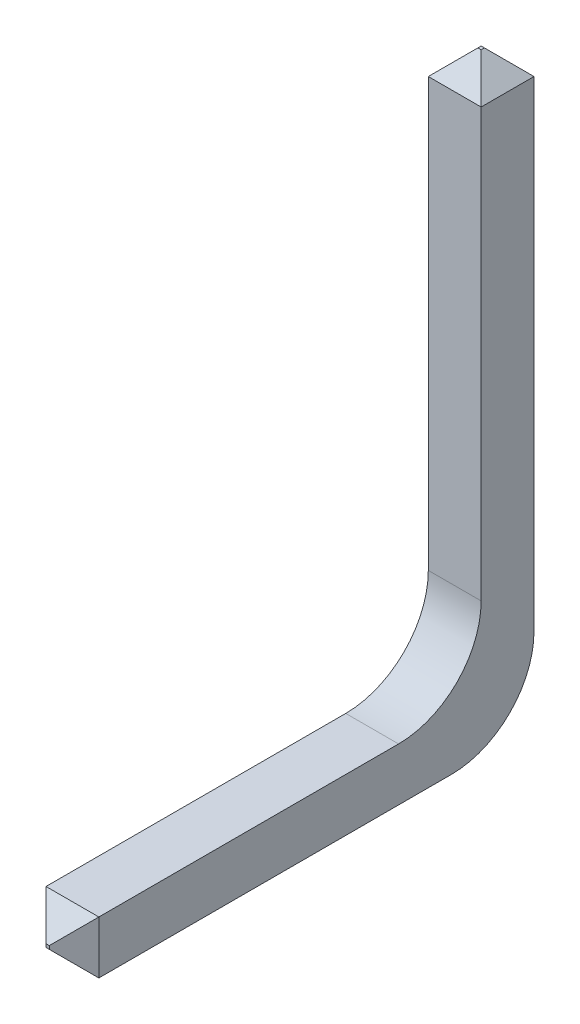
ISO-10303-21;
HEADER;
FILE_DESCRIPTION(('STEP AP214'),'2;1');
FILE_NAME('part.step','',(''),(''),'','','');
FILE_SCHEMA(('AUTOMOTIVE_DESIGN { 1 0 10303 214 1 1 1 1 }'));
ENDSEC;
DATA;
#1=APPLICATION_CONTEXT('core data for automotive mechanical design processes');
#2=APPLICATION_PROTOCOL_DEFINITION('international standard','automotive_design',2000,#1);
#3=PRODUCT_CONTEXT('',#1,'mechanical');
#4=PRODUCT('Part','Part','',(#3));
#5=PRODUCT_RELATED_PRODUCT_CATEGORY('part','',(#4));
#6=PRODUCT_DEFINITION_FORMATION('','',#4);
#7=PRODUCT_DEFINITION_CONTEXT('part definition',#1,'design');
#8=PRODUCT_DEFINITION('design','',#6,#7);
#9=PRODUCT_DEFINITION_SHAPE('','',#8);
#10=(LENGTH_UNIT() NAMED_UNIT(*) SI_UNIT(.MILLI.,.METRE.));
#11=(NAMED_UNIT(*) PLANE_ANGLE_UNIT() SI_UNIT($,.RADIAN.));
#12=(NAMED_UNIT(*) SI_UNIT($,.STERADIAN.) SOLID_ANGLE_UNIT());
#13=UNCERTAINTY_MEASURE_WITH_UNIT(LENGTH_MEASURE(1.E-05),#10,'distance_accuracy_value','');
#14=(GEOMETRIC_REPRESENTATION_CONTEXT(3) GLOBAL_UNCERTAINTY_ASSIGNED_CONTEXT((#13)) GLOBAL_UNIT_ASSIGNED_CONTEXT((#10,
#11,#12)) REPRESENTATION_CONTEXT('',''));
#15=CARTESIAN_POINT('',(0.,0.,0.));
#16=DIRECTION('',(0.,0.,1.));
#17=DIRECTION('',(1.,0.,0.));
#18=AXIS2_PLACEMENT_3D('',#15,#16,#17);
#19=CARTESIAN_POINT('',(39.447289,52.03,2.));
#20=DIRECTION('',(0.,-1.,0.));
#21=DIRECTION('',(0.,0.,-1.));
#22=AXIS2_PLACEMENT_3D('',#19,#20,#21);
#23=PLANE('',#22);
#24=DIRECTION('',(1.,0.,0.));
#25=VECTOR('',#24,1.);
#26=CARTESIAN_POINT('',(38.807289,52.03,1.43));
#27=LINE('',#26,#25);
#28=CARTESIAN_POINT('',(38.807289,52.03,1.43));
#29=VERTEX_POINT('',#28);
#30=CARTESIAN_POINT('',(39.447289,52.03,1.43));
#31=VERTEX_POINT('',#30);
#32=EDGE_CURVE('E149',#29,#31,#27,.T.);
#33=ORIENTED_EDGE('',*,*,#32,.T.);
#34=DIRECTION('',(0.,0.,1.));
#35=VECTOR('',#34,1.);
#36=CARTESIAN_POINT('',(39.447289,52.03,1.43));
#37=LINE('',#36,#35);
#38=CARTESIAN_POINT('',(39.447289,52.03,5.7));
#39=VERTEX_POINT('',#38);
#40=EDGE_CURVE('E143',#31,#39,#37,.T.);
#41=ORIENTED_EDGE('',*,*,#40,.T.);
#42=DIRECTION('',(-1.,0.,0.));
#43=VECTOR('',#42,1.);
#44=CARTESIAN_POINT('',(39.447289,52.03,5.7));
#45=LINE('',#44,#43);
#46=CARTESIAN_POINT('',(38.807289,52.03,5.7));
#47=VERTEX_POINT('',#46);
#48=EDGE_CURVE('E268',#39,#47,#45,.T.);
#49=ORIENTED_EDGE('',*,*,#48,.T.);
#50=DIRECTION('',(0.,0.,-1.));
#51=VECTOR('',#50,1.);
#52=CARTESIAN_POINT('',(38.807289,52.03,5.7));
#53=LINE('',#52,#51);
#54=EDGE_CURVE('E184',#47,#29,#53,.T.);
#55=ORIENTED_EDGE('',*,*,#54,.T.);
#56=EDGE_LOOP('',(#33,#41,#49,#55));
#57=FACE_BOUND('',#56,.T.);
#58=ADVANCED_FACE('F17',(#57),#23,.T.);
#59=CARTESIAN_POINT('',(39.127289,59.,0.92));
#60=DIRECTION('',(0.,-0.707106781186548,-0.707106781186548));
#61=DIRECTION('',(0.,-0.707106781186548,0.707106781186548));
#62=AXIS2_PLACEMENT_3D('',#59,#60,#61);
#63=PLANE('',#62);
#64=DIRECTION('',(-1.,0.,0.));
#65=VECTOR('',#64,1.);
#66=CARTESIAN_POINT('',(39.147289,59.15,0.77));
#67=LINE('',#66,#65);
#68=CARTESIAN_POINT('',(39.147289,59.15,0.77));
#69=VERTEX_POINT('',#68);
#70=CARTESIAN_POINT('',(39.107289,59.15,0.77));
#71=VERTEX_POINT('',#70);
#72=EDGE_CURVE('E221',#69,#71,#67,.T.);
#73=ORIENTED_EDGE('',*,*,#72,.T.);
#74=DIRECTION('',(0.577350269189625,0.577350269189625,-0.577350269189628));
#75=VECTOR('',#74,1.);
#76=CARTESIAN_POINT('',(38.807289,58.85,1.07));
#77=LINE('',#76,#75);
#78=CARTESIAN_POINT('',(38.807289,58.85,1.07));
#79=VERTEX_POINT('',#78);
#80=EDGE_CURVE('E199',#79,#71,#77,.T.);
#81=ORIENTED_EDGE('',*,*,#80,.F.);
#82=DIRECTION('',(1.,0.,0.));
#83=VECTOR('',#82,1.);
#84=CARTESIAN_POINT('',(38.807289,58.85,1.07));
#85=LINE('',#84,#83);
#86=CARTESIAN_POINT('',(39.447289,58.85,1.07));
#87=VERTEX_POINT('',#86);
#88=EDGE_CURVE('E11',#79,#87,#85,.T.);
#89=ORIENTED_EDGE('',*,*,#88,.T.);
#90=DIRECTION('',(0.577350269189625,-0.577350269189625,0.577350269189628));
#91=VECTOR('',#90,1.);
#92=CARTESIAN_POINT('',(39.147289,59.15,0.77));
#93=LINE('',#92,#91);
#94=EDGE_CURVE('E232',#69,#87,#93,.T.);
#95=ORIENTED_EDGE('',*,*,#94,.F.);
#96=EDGE_LOOP('',(#73,#81,#89,#95));
#97=FACE_BOUND('',#96,.T.);
#98=ADVANCED_FACE('F309',(#97),#63,.F.);
#99=CARTESIAN_POINT('',(39.447289,52.67,1.07));
#100=DIRECTION('',(0.,0.,1.));
#101=DIRECTION('',(1.,0.,0.));
#102=AXIS2_PLACEMENT_3D('',#99,#100,#101);
#103=PLANE('',#102);
#104=DIRECTION('',(1.,0.,0.));
#105=VECTOR('',#104,1.);
#106=CARTESIAN_POINT('',(38.807289,53.67,1.07));
#107=LINE('',#106,#105);
#108=CARTESIAN_POINT('',(38.807289,53.67,1.07));
#109=VERTEX_POINT('',#108);
#110=CARTESIAN_POINT('',(39.447289,53.67,1.07));
#111=VERTEX_POINT('',#110);
#112=EDGE_CURVE('E25',#109,#111,#107,.T.);
#113=ORIENTED_EDGE('',*,*,#112,.T.);
#114=DIRECTION('',(0.,1.,0.));
#115=VECTOR('',#114,1.);
#116=CARTESIAN_POINT('',(39.447289,53.67,1.07));
#117=LINE('',#116,#115);
#118=EDGE_CURVE('E243',#111,#87,#117,.T.);
#119=ORIENTED_EDGE('',*,*,#118,.T.);
#120=ORIENTED_EDGE('',*,*,#88,.F.);
#121=DIRECTION('',(0.,-1.,0.));
#122=VECTOR('',#121,1.);
#123=CARTESIAN_POINT('',(38.807289,58.85,1.07));
#124=LINE('',#123,#122);
#125=EDGE_CURVE('E194',#79,#109,#124,.T.);
#126=ORIENTED_EDGE('',*,*,#125,.T.);
#127=EDGE_LOOP('',(#113,#119,#120,#126));
#128=FACE_BOUND('',#127,.T.);
#129=ADVANCED_FACE('F287',(#128),#103,.T.);
#130=CARTESIAN_POINT('',(39.53728678713,53.67,2.07));
#131=DIRECTION('',(1.,0.,0.));
#132=DIRECTION('',(0.,-1.,0.));
#133=AXIS2_PLACEMENT_3D('',#130,#131,#132);
#134=CYLINDRICAL_SURFACE('',#133,1.);
#135=DIRECTION('',(-1.,0.,0.));
#136=VECTOR('',#135,1.);
#137=CARTESIAN_POINT('',(39.447289,52.67,2.07));
#138=LINE('',#137,#136);
#139=CARTESIAN_POINT('',(39.447289,52.67,2.07));
#140=VERTEX_POINT('',#139);
#141=CARTESIAN_POINT('',(38.807289,52.67,2.07));
#142=VERTEX_POINT('',#141);
#143=EDGE_CURVE('E281',#140,#142,#138,.T.);
#144=ORIENTED_EDGE('',*,*,#143,.F.);
#145=CARTESIAN_POINT('',(39.447289,53.67,2.07));
#146=DIRECTION('',(1.,0.,0.));
#147=DIRECTION('',(0.,-1.,0.));
#148=AXIS2_PLACEMENT_3D('',#145,#146,#147);
#149=CIRCLE('',#148,1.);
#150=EDGE_CURVE('E215',#140,#111,#149,.T.);
#151=ORIENTED_EDGE('',*,*,#150,.T.);
#152=ORIENTED_EDGE('',*,*,#112,.F.);
#153=CARTESIAN_POINT('',(38.807289,53.67,2.07));
#154=DIRECTION('',(-1.,0.,0.));
#155=DIRECTION('',(0.,0.,-1.));
#156=AXIS2_PLACEMENT_3D('',#153,#154,#155);
#157=CIRCLE('',#156,1.);
#158=EDGE_CURVE('E181',#109,#142,#157,.T.);
#159=ORIENTED_EDGE('',*,*,#158,.T.);
#160=EDGE_LOOP('',(#144,#151,#152,#159));
#161=FACE_BOUND('',#160,.T.);
#162=ADVANCED_FACE('F293',(#161),#134,.F.);
#163=CARTESIAN_POINT('',(38.807289,52.67,2.));
#164=DIRECTION('',(0.,1.,0.));
#165=DIRECTION('',(1.,0.,0.));
#166=AXIS2_PLACEMENT_3D('',#163,#164,#165);
#167=PLANE('',#166);
#168=DIRECTION('',(-1.,0.,0.));
#169=VECTOR('',#168,1.);
#170=CARTESIAN_POINT('',(39.447289,52.67,5.7));
#171=LINE('',#170,#169);
#172=CARTESIAN_POINT('',(39.447289,52.67,5.7));
#173=VERTEX_POINT('',#172);
#174=CARTESIAN_POINT('',(38.807289,52.67,5.7));
#175=VERTEX_POINT('',#174);
#176=EDGE_CURVE('E278',#173,#175,#171,.T.);
#177=ORIENTED_EDGE('',*,*,#176,.F.);
#178=DIRECTION('',(0.,0.,-1.));
#179=VECTOR('',#178,1.);
#180=CARTESIAN_POINT('',(39.447289,52.67,5.7));
#181=LINE('',#180,#179);
#182=EDGE_CURVE('E210',#173,#140,#181,.T.);
#183=ORIENTED_EDGE('',*,*,#182,.T.);
#184=ORIENTED_EDGE('',*,*,#143,.T.);
#185=DIRECTION('',(0.,0.,1.));
#186=VECTOR('',#185,1.);
#187=CARTESIAN_POINT('',(38.807289,52.67,2.07));
#188=LINE('',#187,#186);
#189=EDGE_CURVE('E177',#142,#175,#188,.T.);
#190=ORIENTED_EDGE('',*,*,#189,.T.);
#191=EDGE_LOOP('',(#177,#183,#184,#190));
#192=FACE_BOUND('',#191,.T.);
#193=ADVANCED_FACE('F319',(#192),#167,.T.);
#194=CARTESIAN_POINT('',(39.127289,52.52,5.85));
#195=DIRECTION('',(0.,-0.707106781186548,-0.707106781186548));
#196=DIRECTION('',(0.,-0.707106781186548,0.707106781186548));
#197=AXIS2_PLACEMENT_3D('',#194,#195,#196);
#198=PLANE('',#197);
#199=ORIENTED_EDGE('',*,*,#176,.T.);
#200=DIRECTION('',(0.577350269189631,-0.577350269189617,0.577350269189629));
#201=VECTOR('',#200,1.);
#202=CARTESIAN_POINT('',(38.807289,52.67,5.7));
#203=LINE('',#202,#201);
#204=CARTESIAN_POINT('',(39.107289,52.37,6.));
#205=VERTEX_POINT('',#204);
#206=EDGE_CURVE('E37',#175,#205,#203,.T.);
#207=ORIENTED_EDGE('',*,*,#206,.T.);
#208=DIRECTION('',(1.,0.,0.));
#209=VECTOR('',#208,1.);
#210=CARTESIAN_POINT('',(39.107289,52.37,6.));
#211=LINE('',#210,#209);
#212=CARTESIAN_POINT('',(39.147289,52.37,6.));
#213=VERTEX_POINT('',#212);
#214=EDGE_CURVE('E271',#205,#213,#211,.T.);
#215=ORIENTED_EDGE('',*,*,#214,.T.);
#216=DIRECTION('',(-0.577350269189625,-0.577350269189625,0.577350269189627));
#217=VECTOR('',#216,1.);
#218=CARTESIAN_POINT('',(39.447289,52.67,5.7));
#219=LINE('',#218,#217);
#220=EDGE_CURVE('E214',#173,#213,#219,.T.);
#221=ORIENTED_EDGE('',*,*,#220,.F.);
#222=EDGE_LOOP('',(#199,#207,#215,#221));
#223=FACE_BOUND('',#222,.T.);
#224=ADVANCED_FACE('F333',(#223),#198,.F.);
#225=CARTESIAN_POINT('',(38.957289,52.35,5.85));
#226=DIRECTION('',(0.707106781186548,0.,-0.707106781186548));
#227=DIRECTION('',(0.,-1.,0.));
#228=AXIS2_PLACEMENT_3D('',#225,#226,#227);
#229=PLANE('',#228);
#230=DIRECTION('',(0.,1.,0.));
#231=VECTOR('',#230,1.);
#232=CARTESIAN_POINT('',(39.107289,52.33,6.));
#233=LINE('',#232,#231);
#234=CARTESIAN_POINT('',(39.107289,52.33,6.));
#235=VERTEX_POINT('',#234);
#236=EDGE_CURVE('E46',#235,#205,#233,.T.);
#237=ORIENTED_EDGE('',*,*,#236,.T.);
#238=ORIENTED_EDGE('',*,*,#206,.F.);
#239=DIRECTION('',(0.,-1.,0.));
#240=VECTOR('',#239,1.);
#241=CARTESIAN_POINT('',(38.807289,52.67,5.7));
#242=LINE('',#241,#240);
#243=EDGE_CURVE('E182',#175,#47,#242,.T.);
#244=ORIENTED_EDGE('',*,*,#243,.T.);
#245=DIRECTION('',(-0.577350269189626,-0.577350269189626,-0.577350269189625));
#246=VECTOR('',#245,1.);
#247=CARTESIAN_POINT('',(39.107289,52.33,6.));
#248=LINE('',#247,#246);
#249=EDGE_CURVE('E264',#235,#47,#248,.T.);
#250=ORIENTED_EDGE('',*,*,#249,.F.);
#251=EDGE_LOOP('',(#237,#238,#244,#250));
#252=FACE_BOUND('',#251,.T.);
#253=ADVANCED_FACE('F331',(#252),#229,.F.);
#254=CARTESIAN_POINT('',(39.53728678713,53.94319870042,6.));
#255=DIRECTION('',(0.,0.,1.));
#256=DIRECTION('',(1.,0.,0.));
#257=AXIS2_PLACEMENT_3D('',#254,#255,#256);
#258=PLANE('',#257);
#259=DIRECTION('',(1.,0.,0.));
#260=VECTOR('',#259,1.);
#261=CARTESIAN_POINT('',(39.107289,52.33,6.));
#262=LINE('',#261,#260);
#263=CARTESIAN_POINT('',(39.147289,52.33,6.));
#264=VERTEX_POINT('',#263);
#265=EDGE_CURVE('E261',#235,#264,#262,.T.);
#266=ORIENTED_EDGE('',*,*,#265,.T.);
#267=DIRECTION('',(0.,1.,0.));
#268=VECTOR('',#267,1.);
#269=CARTESIAN_POINT('',(39.147289,52.33,6.));
#270=LINE('',#269,#268);
#271=EDGE_CURVE('E253',#264,#213,#270,.T.);
#272=ORIENTED_EDGE('',*,*,#271,.T.);
#273=ORIENTED_EDGE('',*,*,#214,.F.);
#274=ORIENTED_EDGE('',*,*,#236,.F.);
#275=EDGE_LOOP('',(#266,#272,#273,#274));
#276=FACE_BOUND('',#275,.T.);
#277=ADVANCED_FACE('F332',(#276),#258,.T.);
#278=CARTESIAN_POINT('',(39.127289,52.18,5.85));
#279=DIRECTION('',(0.,-0.707106781186548,0.707106781186548));
#280=DIRECTION('',(-1.,0.,0.));
#281=AXIS2_PLACEMENT_3D('',#278,#279,#280);
#282=PLANE('',#281);
#283=ORIENTED_EDGE('',*,*,#265,.F.);
#284=ORIENTED_EDGE('',*,*,#249,.T.);
#285=ORIENTED_EDGE('',*,*,#48,.F.);
#286=DIRECTION('',(-0.577350269189625,0.577350269189625,0.577350269189627));
#287=VECTOR('',#286,1.);
#288=CARTESIAN_POINT('',(39.447289,52.03,5.7));
#289=LINE('',#288,#287);
#290=EDGE_CURVE('E257',#39,#264,#289,.T.);
#291=ORIENTED_EDGE('',*,*,#290,.T.);
#292=EDGE_LOOP('',(#283,#284,#285,#291));
#293=FACE_BOUND('',#292,.T.);
#294=ADVANCED_FACE('F329',(#293),#282,.T.);
#295=CARTESIAN_POINT('',(39.297289,52.35,5.85));
#296=DIRECTION('',(0.707106781186548,0.,0.707106781186548));
#297=DIRECTION('',(0.,-1.,0.));
#298=AXIS2_PLACEMENT_3D('',#295,#296,#297);
#299=PLANE('',#298);
#300=DIRECTION('',(0.,-1.,0.));
#301=VECTOR('',#300,1.);
#302=CARTESIAN_POINT('',(39.447289,52.67,5.7));
#303=LINE('',#302,#301);
#304=EDGE_CURVE('E229',#173,#39,#303,.T.);
#305=ORIENTED_EDGE('',*,*,#304,.F.);
#306=ORIENTED_EDGE('',*,*,#220,.T.);
#307=ORIENTED_EDGE('',*,*,#271,.F.);
#308=ORIENTED_EDGE('',*,*,#290,.F.);
#309=EDGE_LOOP('',(#305,#306,#307,#308));
#310=FACE_BOUND('',#309,.T.);
#311=ADVANCED_FACE('F324',(#310),#299,.T.);
#312=CARTESIAN_POINT('',(39.447289,52.67,-3.2));
#313=DIRECTION('',(1.,0.,0.));
#314=DIRECTION('',(0.,1.,0.));
#315=AXIS2_PLACEMENT_3D('',#312,#313,#314);
#316=PLANE('',#315);
#317=ORIENTED_EDGE('',*,*,#304,.T.);
#318=ORIENTED_EDGE('',*,*,#40,.F.);
#319=CARTESIAN_POINT('',(39.447289,53.03,1.43));
#320=DIRECTION('',(-1.,0.,0.));
#321=DIRECTION('',(0.,0.,-1.));
#322=AXIS2_PLACEMENT_3D('',#319,#320,#321);
#323=CIRCLE('',#322,1.);
#324=CARTESIAN_POINT('',(39.447289,53.03,0.43));
#325=VERTEX_POINT('',#324);
#326=EDGE_CURVE('E135',#325,#31,#323,.T.);
#327=ORIENTED_EDGE('',*,*,#326,.F.);
#328=DIRECTION('',(0.,1.,0.));
#329=VECTOR('',#328,1.);
#330=CARTESIAN_POINT('',(39.447289,53.03,0.43));
#331=LINE('',#330,#329);
#332=CARTESIAN_POINT('',(39.447289,58.85,0.43));
#333=VERTEX_POINT('',#332);
#334=EDGE_CURVE('E140',#325,#333,#331,.T.);
#335=ORIENTED_EDGE('',*,*,#334,.T.);
#336=DIRECTION('',(0.,0.,1.));
#337=VECTOR('',#336,1.);
#338=CARTESIAN_POINT('',(39.447289,58.85,0.43000000000003));
#339=LINE('',#338,#337);
#340=EDGE_CURVE('E235',#333,#87,#339,.T.);
#341=ORIENTED_EDGE('',*,*,#340,.T.);
#342=ORIENTED_EDGE('',*,*,#118,.F.);
#343=ORIENTED_EDGE('',*,*,#150,.F.);
#344=ORIENTED_EDGE('',*,*,#182,.F.);
#345=EDGE_LOOP('',(#317,#318,#327,#335,#341,#342,#343,#344));
#346=FACE_BOUND('',#345,.T.);
#347=ADVANCED_FACE('F138',(#346),#316,.T.);
#348=CARTESIAN_POINT('',(39.297289,59.,0.75));
#349=DIRECTION('',(0.707106781186548,0.707106781186548,0.));
#350=DIRECTION('',(0.,0.,-1.));
#351=AXIS2_PLACEMENT_3D('',#348,#349,#350);
#352=PLANE('',#351);
#353=ORIENTED_EDGE('',*,*,#340,.F.);
#354=DIRECTION('',(-0.57735026918969,0.577350269189595,0.577350269189593));
#355=VECTOR('',#354,1.);
#356=CARTESIAN_POINT('',(39.447289,58.85,0.43));
#357=LINE('',#356,#355);
#358=CARTESIAN_POINT('',(39.147289,59.15,0.73));
#359=VERTEX_POINT('',#358);
#360=EDGE_CURVE('E226',#333,#359,#357,.T.);
#361=ORIENTED_EDGE('',*,*,#360,.T.);
#362=DIRECTION('',(0.,0.,-1.));
#363=VECTOR('',#362,1.);
#364=CARTESIAN_POINT('',(39.147289,59.15,0.77));
#365=LINE('',#364,#363);
#366=EDGE_CURVE('E222',#69,#359,#365,.T.);
#367=ORIENTED_EDGE('',*,*,#366,.F.);
#368=ORIENTED_EDGE('',*,*,#94,.T.);
#369=EDGE_LOOP('',(#353,#361,#367,#368));
#370=FACE_BOUND('',#369,.T.);
#371=ADVANCED_FACE('F297',(#370),#352,.T.);
#372=CARTESIAN_POINT('',(39.127289,59.,0.58));
#373=DIRECTION('',(0.,0.707106781186548,-0.707106781186548));
#374=DIRECTION('',(-1.,0.,0.));
#375=AXIS2_PLACEMENT_3D('',#372,#373,#374);
#376=PLANE('',#375);
#377=DIRECTION('',(-1.,0.,0.));
#378=VECTOR('',#377,1.);
#379=CARTESIAN_POINT('',(39.147289,59.15,0.73));
#380=LINE('',#379,#378);
#381=CARTESIAN_POINT('',(39.107289,59.15,0.73));
#382=VERTEX_POINT('',#381);
#383=EDGE_CURVE('E203',#359,#382,#380,.T.);
#384=ORIENTED_EDGE('',*,*,#383,.F.);
#385=ORIENTED_EDGE('',*,*,#360,.F.);
#386=DIRECTION('',(-1.,0.,0.));
#387=VECTOR('',#386,1.);
#388=CARTESIAN_POINT('',(39.447289,58.85,0.43));
#389=LINE('',#388,#387);
#390=CARTESIAN_POINT('',(38.807289,58.85,0.43));
#391=VERTEX_POINT('',#390);
#392=EDGE_CURVE('E157',#333,#391,#389,.T.);
#393=ORIENTED_EDGE('',*,*,#392,.T.);
#394=DIRECTION('',(0.577350269189623,0.577350269189623,0.577350269189632));
#395=VECTOR('',#394,1.);
#396=CARTESIAN_POINT('',(38.807289,58.85,0.43));
#397=LINE('',#396,#395);
#398=EDGE_CURVE('E174',#391,#382,#397,.T.);
#399=ORIENTED_EDGE('',*,*,#398,.T.);
#400=EDGE_LOOP('',(#384,#385,#393,#399));
#401=FACE_BOUND('',#400,.T.);
#402=ADVANCED_FACE('F301',(#401),#376,.T.);
#403=CARTESIAN_POINT('',(39.04152428628,59.15,0.5898026791798));
#404=DIRECTION('',(0.,1.,0.));
#405=DIRECTION('',(1.,0.,0.));
#406=AXIS2_PLACEMENT_3D('',#403,#404,#405);
#407=PLANE('',#406);
#408=ORIENTED_EDGE('',*,*,#383,.T.);
#409=DIRECTION('',(0.,0.,-1.));
#410=VECTOR('',#409,1.);
#411=CARTESIAN_POINT('',(39.107289,59.15,0.77));
#412=LINE('',#411,#410);
#413=EDGE_CURVE('E186',#71,#382,#412,.T.);
#414=ORIENTED_EDGE('',*,*,#413,.F.);
#415=ORIENTED_EDGE('',*,*,#72,.F.);
#416=ORIENTED_EDGE('',*,*,#366,.T.);
#417=EDGE_LOOP('',(#408,#414,#415,#416));
#418=FACE_BOUND('',#417,.T.);
#419=ADVANCED_FACE('F305',(#418),#407,.T.);
#420=CARTESIAN_POINT('',(38.957289,59.,0.75));
#421=DIRECTION('',(0.707106781186548,-0.707106781186548,0.));
#422=DIRECTION('',(0.,0.,-1.));
#423=AXIS2_PLACEMENT_3D('',#420,#421,#422);
#424=PLANE('',#423);
#425=ORIENTED_EDGE('',*,*,#413,.T.);
#426=ORIENTED_EDGE('',*,*,#398,.F.);
#427=DIRECTION('',(0.,0.,1.));
#428=VECTOR('',#427,1.);
#429=CARTESIAN_POINT('',(38.807289,58.85,0.43));
#430=LINE('',#429,#428);
#431=EDGE_CURVE('E190',#391,#79,#430,.T.);
#432=ORIENTED_EDGE('',*,*,#431,.T.);
#433=ORIENTED_EDGE('',*,*,#80,.T.);
#434=EDGE_LOOP('',(#425,#426,#432,#433));
#435=FACE_BOUND('',#434,.T.);
#436=ADVANCED_FACE('F311',(#435),#424,.F.);
#437=CARTESIAN_POINT('',(38.807289,52.03,2.));
#438=DIRECTION('',(-1.,0.,0.));
#439=DIRECTION('',(0.,0.,1.));
#440=AXIS2_PLACEMENT_3D('',#437,#438,#439);
#441=PLANE('',#440);
#442=DIRECTION('',(0.,-1.,0.));
#443=VECTOR('',#442,1.);
#444=CARTESIAN_POINT('',(38.807289,58.85,0.43));
#445=LINE('',#444,#443);
#446=CARTESIAN_POINT('',(38.807289,53.03,0.43));
#447=VERTEX_POINT('',#446);
#448=EDGE_CURVE('E165',#391,#447,#445,.T.);
#449=ORIENTED_EDGE('',*,*,#448,.T.);
#450=CARTESIAN_POINT('',(38.807289,53.03,1.43));
#451=DIRECTION('',(1.,0.,0.));
#452=DIRECTION('',(0.,-1.,0.));
#453=AXIS2_PLACEMENT_3D('',#450,#451,#452);
#454=CIRCLE('',#453,1.);
#455=EDGE_CURVE('E162',#29,#447,#454,.T.);
#456=ORIENTED_EDGE('',*,*,#455,.F.);
#457=ORIENTED_EDGE('',*,*,#54,.F.);
#458=ORIENTED_EDGE('',*,*,#243,.F.);
#459=ORIENTED_EDGE('',*,*,#189,.F.);
#460=ORIENTED_EDGE('',*,*,#158,.F.);
#461=ORIENTED_EDGE('',*,*,#125,.F.);
#462=ORIENTED_EDGE('',*,*,#431,.F.);
#463=EDGE_LOOP('',(#449,#456,#457,#458,#459,#460,#461,#462));
#464=FACE_BOUND('',#463,.T.);
#465=ADVANCED_FACE('F314',(#464),#441,.T.);
#466=CARTESIAN_POINT('',(39.53728678713,53.03,1.43));
#467=DIRECTION('',(-1.,0.,0.));
#468=DIRECTION('',(0.,1.,0.));
#469=AXIS2_PLACEMENT_3D('',#466,#467,#468);
#470=CYLINDRICAL_SURFACE('',#469,1.);
#471=DIRECTION('',(-1.,0.,0.));
#472=VECTOR('',#471,1.);
#473=CARTESIAN_POINT('',(39.447289,53.03,0.43));
#474=LINE('',#473,#472);
#475=EDGE_CURVE('E155',#325,#447,#474,.T.);
#476=ORIENTED_EDGE('',*,*,#475,.F.);
#477=ORIENTED_EDGE('',*,*,#326,.T.);
#478=ORIENTED_EDGE('',*,*,#32,.F.);
#479=ORIENTED_EDGE('',*,*,#455,.T.);
#480=EDGE_LOOP('',(#476,#477,#478,#479));
#481=FACE_BOUND('',#480,.T.);
#482=ADVANCED_FACE('F160',(#481),#470,.T.);
#483=CARTESIAN_POINT('',(39.53728678713,53.94319870042,0.43));
#484=DIRECTION('',(0.,0.,1.));
#485=DIRECTION('',(1.,0.,0.));
#486=AXIS2_PLACEMENT_3D('',#483,#484,#485);
#487=PLANE('',#486);
#488=ORIENTED_EDGE('',*,*,#475,.T.);
#489=ORIENTED_EDGE('',*,*,#448,.F.);
#490=ORIENTED_EDGE('',*,*,#392,.F.);
#491=ORIENTED_EDGE('',*,*,#334,.F.);
#492=EDGE_LOOP('',(#488,#489,#490,#491));
#493=FACE_BOUND('',#492,.T.);
#494=ADVANCED_FACE('F153',(#493),#487,.F.);
#495=CLOSED_SHELL('',(#58,#98,#129,#162,#193,#224,#253,#277,#294,#311,#347,#371,#402,#419,#436,
#465,#482,#494));
#496=MANIFOLD_SOLID_BREP('B1',#495);
#497=ADVANCED_BREP_SHAPE_REPRESENTATION('',(#18,#496),#14);
#498=SHAPE_DEFINITION_REPRESENTATION(#9,#497);
ENDSEC;
END-ISO-10303-21;
